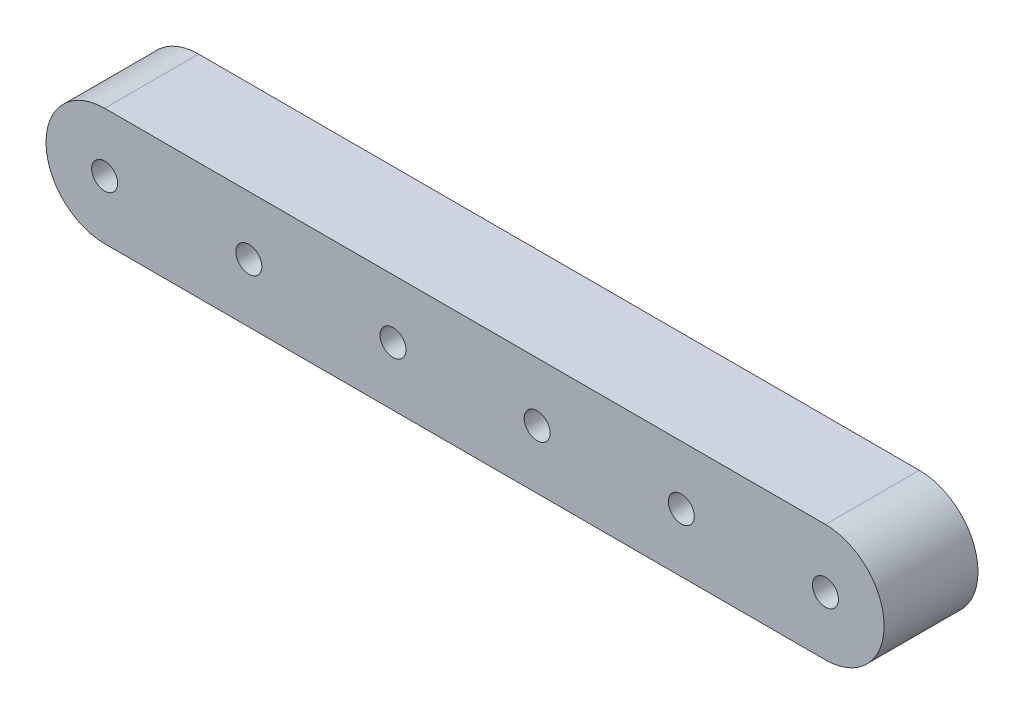
ISO-10303-21;
HEADER;
FILE_DESCRIPTION(('STEP AP214'),'2;1');
FILE_NAME('part.step','',(''),(''),'','','');
FILE_SCHEMA(('AUTOMOTIVE_DESIGN { 1 0 10303 214 1 1 1 1 }'));
ENDSEC;
DATA;
#1=APPLICATION_CONTEXT('core data for automotive mechanical design processes');
#2=APPLICATION_PROTOCOL_DEFINITION('international standard','automotive_design',2000,#1);
#3=PRODUCT_CONTEXT('',#1,'mechanical');
#4=PRODUCT('Part','Part','',(#3));
#5=PRODUCT_RELATED_PRODUCT_CATEGORY('part','',(#4));
#6=PRODUCT_DEFINITION_FORMATION('','',#4);
#7=PRODUCT_DEFINITION_CONTEXT('part definition',#1,'design');
#8=PRODUCT_DEFINITION('design','',#6,#7);
#9=PRODUCT_DEFINITION_SHAPE('','',#8);
#10=(LENGTH_UNIT() NAMED_UNIT(*) SI_UNIT(.MILLI.,.METRE.));
#11=(NAMED_UNIT(*) PLANE_ANGLE_UNIT() SI_UNIT($,.RADIAN.));
#12=(NAMED_UNIT(*) SI_UNIT($,.STERADIAN.) SOLID_ANGLE_UNIT());
#13=UNCERTAINTY_MEASURE_WITH_UNIT(LENGTH_MEASURE(1.E-05),#10,'distance_accuracy_value','');
#14=(GEOMETRIC_REPRESENTATION_CONTEXT(3) GLOBAL_UNCERTAINTY_ASSIGNED_CONTEXT((#13)) GLOBAL_UNIT_ASSIGNED_CONTEXT((#10,
#11,#12)) REPRESENTATION_CONTEXT('',''));
#15=CARTESIAN_POINT('',(0.,0.,0.));
#16=DIRECTION('',(0.,0.,1.));
#17=DIRECTION('',(1.,0.,0.));
#18=AXIS2_PLACEMENT_3D('',#15,#16,#17);
#19=CARTESIAN_POINT('',(-54.8096085409253,0.,-5.6));
#20=DIRECTION('',(0.,0.,1.));
#21=DIRECTION('',(1.,0.,0.));
#22=AXIS2_PLACEMENT_3D('',#19,#20,#21);
#23=CYLINDRICAL_SURFACE('',#22,7.);
#24=DIRECTION('',(0.,0.,1.));
#25=VECTOR('',#24,1.);
#26=CARTESIAN_POINT('',(-54.8096085409253,-7.,-5.6));
#27=LINE('',#26,#25);
#28=CARTESIAN_POINT('',(-54.8096085409253,-7.,-5.6));
#29=VERTEX_POINT('',#28);
#30=CARTESIAN_POINT('',(-54.8096085409253,-7.,5.6));
#31=VERTEX_POINT('',#30);
#32=EDGE_CURVE('E40',#29,#31,#27,.T.);
#33=ORIENTED_EDGE('',*,*,#32,.T.);
#34=CARTESIAN_POINT('',(-54.8096085409253,0.,5.6));
#35=DIRECTION('',(0.,0.,1.));
#36=DIRECTION('',(1.,0.,0.));
#37=AXIS2_PLACEMENT_3D('',#34,#35,#36);
#38=CIRCLE('',#37,7.);
#39=CARTESIAN_POINT('',(-54.8096085409253,7.,5.6));
#40=VERTEX_POINT('',#39);
#41=EDGE_CURVE('E77',#40,#31,#38,.T.);
#42=ORIENTED_EDGE('',*,*,#41,.F.);
#43=DIRECTION('',(0.,0.,1.));
#44=VECTOR('',#43,1.);
#45=CARTESIAN_POINT('',(-54.8096085409253,7.,-5.6));
#46=LINE('',#45,#44);
#47=CARTESIAN_POINT('',(-54.8096085409253,7.,-5.6));
#48=VERTEX_POINT('',#47);
#49=EDGE_CURVE('E11',#48,#40,#46,.T.);
#50=ORIENTED_EDGE('',*,*,#49,.F.);
#51=CARTESIAN_POINT('',(-54.8096085409253,0.,-5.6));
#52=DIRECTION('',(0.,0.,1.));
#53=DIRECTION('',(1.,0.,0.));
#54=AXIS2_PLACEMENT_3D('',#51,#52,#53);
#55=CIRCLE('',#54,7.);
#56=EDGE_CURVE('E78',#48,#29,#55,.T.);
#57=ORIENTED_EDGE('',*,*,#56,.T.);
#58=EDGE_LOOP('',(#33,#42,#50,#57));
#59=FACE_BOUND('',#58,.T.);
#60=ADVANCED_FACE('F37',(#59),#23,.T.);
#61=CARTESIAN_POINT('',(-54.8096085409253,7.,-5.6));
#62=DIRECTION('',(0.,1.,0.));
#63=DIRECTION('',(0.,0.,1.));
#64=AXIS2_PLACEMENT_3D('',#61,#62,#63);
#65=PLANE('',#64);
#66=ORIENTED_EDGE('',*,*,#49,.T.);
#67=DIRECTION('',(-1.,0.,0.));
#68=VECTOR('',#67,1.);
#69=CARTESIAN_POINT('',(-54.8096085409253,7.,5.6));
#70=LINE('',#69,#68);
#71=CARTESIAN_POINT('',(31.1903914590747,7.,5.6));
#72=VERTEX_POINT('',#71);
#73=EDGE_CURVE('E94',#72,#40,#70,.T.);
#74=ORIENTED_EDGE('',*,*,#73,.F.);
#75=DIRECTION('',(0.,0.,1.));
#76=VECTOR('',#75,1.);
#77=CARTESIAN_POINT('',(31.1903914590747,7.,-5.6));
#78=LINE('',#77,#76);
#79=CARTESIAN_POINT('',(31.1903914590747,7.,-5.6));
#80=VERTEX_POINT('',#79);
#81=EDGE_CURVE('E45',#80,#72,#78,.T.);
#82=ORIENTED_EDGE('',*,*,#81,.F.);
#83=DIRECTION('',(-1.,0.,0.));
#84=VECTOR('',#83,1.);
#85=CARTESIAN_POINT('',(-54.8096085409253,7.,-5.6));
#86=LINE('',#85,#84);
#87=EDGE_CURVE('E83',#80,#48,#86,.T.);
#88=ORIENTED_EDGE('',*,*,#87,.T.);
#89=EDGE_LOOP('',(#66,#74,#82,#88));
#90=FACE_BOUND('',#89,.T.);
#91=ADVANCED_FACE('F116',(#90),#65,.T.);
#92=CARTESIAN_POINT('',(31.1903914590747,0.,-5.6));
#93=DIRECTION('',(0.,0.,1.));
#94=DIRECTION('',(1.,0.,0.));
#95=AXIS2_PLACEMENT_3D('',#92,#93,#94);
#96=CYLINDRICAL_SURFACE('',#95,7.);
#97=ORIENTED_EDGE('',*,*,#81,.T.);
#98=CARTESIAN_POINT('',(31.1903914590747,0.,5.6));
#99=DIRECTION('',(0.,0.,1.));
#100=DIRECTION('',(1.,0.,0.));
#101=AXIS2_PLACEMENT_3D('',#98,#99,#100);
#102=CIRCLE('',#101,7.);
#103=CARTESIAN_POINT('',(31.1903914590747,-7.,5.6));
#104=VERTEX_POINT('',#103);
#105=EDGE_CURVE('E90',#104,#72,#102,.T.);
#106=ORIENTED_EDGE('',*,*,#105,.F.);
#107=DIRECTION('',(0.,0.,1.));
#108=VECTOR('',#107,1.);
#109=CARTESIAN_POINT('',(31.1903914590747,-7.,-5.6));
#110=LINE('',#109,#108);
#111=CARTESIAN_POINT('',(31.1903914590747,-7.,-5.6));
#112=VERTEX_POINT('',#111);
#113=EDGE_CURVE('E82',#112,#104,#110,.T.);
#114=ORIENTED_EDGE('',*,*,#113,.F.);
#115=CARTESIAN_POINT('',(31.1903914590747,0.,-5.6));
#116=DIRECTION('',(0.,0.,1.));
#117=DIRECTION('',(1.,0.,0.));
#118=AXIS2_PLACEMENT_3D('',#115,#116,#117);
#119=CIRCLE('',#118,7.);
#120=EDGE_CURVE('E109',#112,#80,#119,.T.);
#121=ORIENTED_EDGE('',*,*,#120,.T.);
#122=EDGE_LOOP('',(#97,#106,#114,#121));
#123=FACE_BOUND('',#122,.T.);
#124=ADVANCED_FACE('F113',(#123),#96,.T.);
#125=CARTESIAN_POINT('',(-54.8096085409253,-7.,-5.6));
#126=DIRECTION('',(0.,-1.,0.));
#127=DIRECTION('',(0.,0.,-1.));
#128=AXIS2_PLACEMENT_3D('',#125,#126,#127);
#129=PLANE('',#128);
#130=ORIENTED_EDGE('',*,*,#113,.T.);
#131=DIRECTION('',(1.,0.,0.));
#132=VECTOR('',#131,1.);
#133=CARTESIAN_POINT('',(-54.8096085409253,-7.,5.6));
#134=LINE('',#133,#132);
#135=EDGE_CURVE('E85',#31,#104,#134,.T.);
#136=ORIENTED_EDGE('',*,*,#135,.F.);
#137=ORIENTED_EDGE('',*,*,#32,.F.);
#138=DIRECTION('',(1.,0.,0.));
#139=VECTOR('',#138,1.);
#140=CARTESIAN_POINT('',(-54.8096085409253,-7.,-5.6));
#141=LINE('',#140,#139);
#142=EDGE_CURVE('E107',#29,#112,#141,.T.);
#143=ORIENTED_EDGE('',*,*,#142,.T.);
#144=EDGE_LOOP('',(#130,#136,#137,#143));
#145=FACE_BOUND('',#144,.T.);
#146=ADVANCED_FACE('F86',(#145),#129,.T.);
#147=CARTESIAN_POINT('',(-54.8096085409253,0.,-5.6));
#148=DIRECTION('',(0.,0.,1.));
#149=DIRECTION('',(1.,0.,0.));
#150=AXIS2_PLACEMENT_3D('',#147,#148,#149);
#151=PLANE('',#150);
#152=CARTESIAN_POINT('',(-54.8096085409253,0.,-5.6));
#153=DIRECTION('',(0.,0.,1.));
#154=DIRECTION('',(1.,0.,0.));
#155=AXIS2_PLACEMENT_3D('',#152,#153,#154);
#156=CIRCLE('',#155,1.55);
#157=CARTESIAN_POINT('',(-53.2596085409253,0.,-5.6));
#158=VERTEX_POINT('',#157);
#159=EDGE_CURVE('E98',#158,#158,#156,.T.);
#160=ORIENTED_EDGE('',*,*,#159,.T.);
#161=EDGE_LOOP('',(#160));
#162=FACE_BOUND('',#161,.T.);
#163=CARTESIAN_POINT('',(-37.6096085409253,0.,-5.6));
#164=DIRECTION('',(0.,0.,1.));
#165=DIRECTION('',(1.,0.,0.));
#166=AXIS2_PLACEMENT_3D('',#163,#164,#165);
#167=CIRCLE('',#166,1.55);
#168=CARTESIAN_POINT('',(-36.0596085409253,0.,-5.6));
#169=VERTEX_POINT('',#168);
#170=EDGE_CURVE('E257',#169,#169,#167,.T.);
#171=ORIENTED_EDGE('',*,*,#170,.T.);
#172=EDGE_LOOP('',(#171));
#173=FACE_BOUND('',#172,.T.);
#174=CARTESIAN_POINT('',(-20.4096085409253,0.,-5.6));
#175=DIRECTION('',(0.,0.,1.));
#176=DIRECTION('',(1.,0.,0.));
#177=AXIS2_PLACEMENT_3D('',#174,#175,#176);
#178=CIRCLE('',#177,1.55);
#179=CARTESIAN_POINT('',(-18.8596085409253,0.,-5.6));
#180=VERTEX_POINT('',#179);
#181=EDGE_CURVE('E253',#180,#180,#178,.T.);
#182=ORIENTED_EDGE('',*,*,#181,.T.);
#183=EDGE_LOOP('',(#182));
#184=FACE_BOUND('',#183,.T.);
#185=CARTESIAN_POINT('',(-3.20960854092527,0.,-5.6));
#186=DIRECTION('',(0.,0.,1.));
#187=DIRECTION('',(1.,0.,0.));
#188=AXIS2_PLACEMENT_3D('',#185,#186,#187);
#189=CIRCLE('',#188,1.55);
#190=CARTESIAN_POINT('',(-1.65960854092527,0.,-5.6));
#191=VERTEX_POINT('',#190);
#192=EDGE_CURVE('E250',#191,#191,#189,.T.);
#193=ORIENTED_EDGE('',*,*,#192,.T.);
#194=EDGE_LOOP('',(#193));
#195=FACE_BOUND('',#194,.T.);
#196=CARTESIAN_POINT('',(13.9903914590747,0.,-5.6));
#197=DIRECTION('',(0.,0.,1.));
#198=DIRECTION('',(1.,0.,0.));
#199=AXIS2_PLACEMENT_3D('',#196,#197,#198);
#200=CIRCLE('',#199,1.55);
#201=CARTESIAN_POINT('',(15.5403914590747,0.,-5.6));
#202=VERTEX_POINT('',#201);
#203=EDGE_CURVE('E242',#202,#202,#200,.T.);
#204=ORIENTED_EDGE('',*,*,#203,.T.);
#205=EDGE_LOOP('',(#204));
#206=FACE_BOUND('',#205,.T.);
#207=CARTESIAN_POINT('',(31.1903914590747,0.,-5.6));
#208=DIRECTION('',(0.,0.,1.));
#209=DIRECTION('',(1.,0.,0.));
#210=AXIS2_PLACEMENT_3D('',#207,#208,#209);
#211=CIRCLE('',#210,1.55);
#212=CARTESIAN_POINT('',(32.7403914590747,0.,-5.6));
#213=VERTEX_POINT('',#212);
#214=EDGE_CURVE('E243',#213,#213,#211,.T.);
#215=ORIENTED_EDGE('',*,*,#214,.T.);
#216=EDGE_LOOP('',(#215));
#217=FACE_BOUND('',#216,.T.);
#218=ORIENTED_EDGE('',*,*,#56,.F.);
#219=ORIENTED_EDGE('',*,*,#87,.F.);
#220=ORIENTED_EDGE('',*,*,#120,.F.);
#221=ORIENTED_EDGE('',*,*,#142,.F.);
#222=EDGE_LOOP('',(#218,#219,#220,#221));
#223=FACE_BOUND('',#222,.T.);
#224=ADVANCED_FACE('F118',(#162,#173,#184,#195,#206,#217,#223),#151,.F.);
#225=CARTESIAN_POINT('',(-54.8096085409253,0.,5.6));
#226=DIRECTION('',(0.,0.,1.));
#227=DIRECTION('',(1.,0.,0.));
#228=AXIS2_PLACEMENT_3D('',#225,#226,#227);
#229=PLANE('',#228);
#230=CARTESIAN_POINT('',(-54.8096085409253,0.,5.6));
#231=DIRECTION('',(0.,0.,1.));
#232=DIRECTION('',(1.,0.,0.));
#233=AXIS2_PLACEMENT_3D('',#230,#231,#232);
#234=CIRCLE('',#233,1.55);
#235=CARTESIAN_POINT('',(-53.2596085409253,0.,5.6));
#236=VERTEX_POINT('',#235);
#237=EDGE_CURVE('E95',#236,#236,#234,.T.);
#238=ORIENTED_EDGE('',*,*,#237,.F.);
#239=EDGE_LOOP('',(#238));
#240=FACE_BOUND('',#239,.T.);
#241=CARTESIAN_POINT('',(-37.6096085409253,0.,5.6));
#242=DIRECTION('',(0.,0.,1.));
#243=DIRECTION('',(1.,0.,0.));
#244=AXIS2_PLACEMENT_3D('',#241,#242,#243);
#245=CIRCLE('',#244,1.55);
#246=CARTESIAN_POINT('',(-36.0596085409253,0.,5.6));
#247=VERTEX_POINT('',#246);
#248=EDGE_CURVE('E226',#247,#247,#245,.T.);
#249=ORIENTED_EDGE('',*,*,#248,.F.);
#250=EDGE_LOOP('',(#249));
#251=FACE_BOUND('',#250,.T.);
#252=CARTESIAN_POINT('',(-20.4096085409253,0.,5.6));
#253=DIRECTION('',(0.,0.,1.));
#254=DIRECTION('',(1.,0.,0.));
#255=AXIS2_PLACEMENT_3D('',#252,#253,#254);
#256=CIRCLE('',#255,1.55);
#257=CARTESIAN_POINT('',(-18.8596085409253,0.,5.6));
#258=VERTEX_POINT('',#257);
#259=EDGE_CURVE('E230',#258,#258,#256,.T.);
#260=ORIENTED_EDGE('',*,*,#259,.F.);
#261=EDGE_LOOP('',(#260));
#262=FACE_BOUND('',#261,.T.);
#263=CARTESIAN_POINT('',(-3.20960854092527,0.,5.6));
#264=DIRECTION('',(0.,0.,1.));
#265=DIRECTION('',(1.,0.,0.));
#266=AXIS2_PLACEMENT_3D('',#263,#264,#265);
#267=CIRCLE('',#266,1.55);
#268=CARTESIAN_POINT('',(-1.65960854092527,0.,5.6));
#269=VERTEX_POINT('',#268);
#270=EDGE_CURVE('E234',#269,#269,#267,.T.);
#271=ORIENTED_EDGE('',*,*,#270,.F.);
#272=EDGE_LOOP('',(#271));
#273=FACE_BOUND('',#272,.T.);
#274=CARTESIAN_POINT('',(13.9903914590747,0.,5.6));
#275=DIRECTION('',(0.,0.,1.));
#276=DIRECTION('',(1.,0.,0.));
#277=AXIS2_PLACEMENT_3D('',#274,#275,#276);
#278=CIRCLE('',#277,1.55);
#279=CARTESIAN_POINT('',(15.5403914590747,0.,5.6));
#280=VERTEX_POINT('',#279);
#281=EDGE_CURVE('E238',#280,#280,#278,.T.);
#282=ORIENTED_EDGE('',*,*,#281,.F.);
#283=EDGE_LOOP('',(#282));
#284=FACE_BOUND('',#283,.T.);
#285=CARTESIAN_POINT('',(31.1903914590747,0.,5.6));
#286=DIRECTION('',(0.,0.,1.));
#287=DIRECTION('',(1.,0.,0.));
#288=AXIS2_PLACEMENT_3D('',#285,#286,#287);
#289=CIRCLE('',#288,1.55);
#290=CARTESIAN_POINT('',(32.7403914590747,0.,5.6));
#291=VERTEX_POINT('',#290);
#292=EDGE_CURVE('E101',#291,#291,#289,.T.);
#293=ORIENTED_EDGE('',*,*,#292,.F.);
#294=EDGE_LOOP('',(#293));
#295=FACE_BOUND('',#294,.T.);
#296=ORIENTED_EDGE('',*,*,#41,.T.);
#297=ORIENTED_EDGE('',*,*,#135,.T.);
#298=ORIENTED_EDGE('',*,*,#105,.T.);
#299=ORIENTED_EDGE('',*,*,#73,.T.);
#300=EDGE_LOOP('',(#296,#297,#298,#299));
#301=FACE_BOUND('',#300,.T.);
#302=ADVANCED_FACE('F93',(#240,#251,#262,#273,#284,#295,#301),#229,.T.);
#303=CARTESIAN_POINT('',(31.1903914590747,0.,9.9840620433566));
#304=DIRECTION('',(0.,0.,-1.));
#305=DIRECTION('',(-1.,0.,0.));
#306=AXIS2_PLACEMENT_3D('',#303,#304,#305);
#307=CYLINDRICAL_SURFACE('',#306,1.55);
#308=ORIENTED_EDGE('',*,*,#214,.F.);
#309=EDGE_LOOP('',(#308));
#310=FACE_BOUND('',#309,.T.);
#311=ORIENTED_EDGE('',*,*,#292,.T.);
#312=EDGE_LOOP('',(#311));
#313=FACE_BOUND('',#312,.T.);
#314=ADVANCED_FACE('F126',(#310,#313),#307,.F.);
#315=CARTESIAN_POINT('',(13.9903914590747,0.,9.9840620433566));
#316=DIRECTION('',(0.,0.,-1.));
#317=DIRECTION('',(-1.,0.,0.));
#318=AXIS2_PLACEMENT_3D('',#315,#316,#317);
#319=CYLINDRICAL_SURFACE('',#318,1.55);
#320=ORIENTED_EDGE('',*,*,#203,.F.);
#321=EDGE_LOOP('',(#320));
#322=FACE_BOUND('',#321,.T.);
#323=ORIENTED_EDGE('',*,*,#281,.T.);
#324=EDGE_LOOP('',(#323));
#325=FACE_BOUND('',#324,.T.);
#326=ADVANCED_FACE('F165',(#322,#325),#319,.F.);
#327=CARTESIAN_POINT('',(-3.20960854092527,0.,9.9840620433566));
#328=DIRECTION('',(0.,0.,-1.));
#329=DIRECTION('',(-1.,0.,0.));
#330=AXIS2_PLACEMENT_3D('',#327,#328,#329);
#331=CYLINDRICAL_SURFACE('',#330,1.55);
#332=ORIENTED_EDGE('',*,*,#192,.F.);
#333=EDGE_LOOP('',(#332));
#334=FACE_BOUND('',#333,.T.);
#335=ORIENTED_EDGE('',*,*,#270,.T.);
#336=EDGE_LOOP('',(#335));
#337=FACE_BOUND('',#336,.T.);
#338=ADVANCED_FACE('F175',(#334,#337),#331,.F.);
#339=CARTESIAN_POINT('',(-20.4096085409253,0.,9.9840620433566));
#340=DIRECTION('',(0.,0.,-1.));
#341=DIRECTION('',(-1.,0.,0.));
#342=AXIS2_PLACEMENT_3D('',#339,#340,#341);
#343=CYLINDRICAL_SURFACE('',#342,1.55);
#344=ORIENTED_EDGE('',*,*,#181,.F.);
#345=EDGE_LOOP('',(#344));
#346=FACE_BOUND('',#345,.T.);
#347=ORIENTED_EDGE('',*,*,#259,.T.);
#348=EDGE_LOOP('',(#347));
#349=FACE_BOUND('',#348,.T.);
#350=ADVANCED_FACE('F185',(#346,#349),#343,.F.);
#351=CARTESIAN_POINT('',(-37.6096085409253,0.,9.9840620433566));
#352=DIRECTION('',(0.,0.,-1.));
#353=DIRECTION('',(-1.,0.,0.));
#354=AXIS2_PLACEMENT_3D('',#351,#352,#353);
#355=CYLINDRICAL_SURFACE('',#354,1.55);
#356=ORIENTED_EDGE('',*,*,#170,.F.);
#357=EDGE_LOOP('',(#356));
#358=FACE_BOUND('',#357,.T.);
#359=ORIENTED_EDGE('',*,*,#248,.T.);
#360=EDGE_LOOP('',(#359));
#361=FACE_BOUND('',#360,.T.);
#362=ADVANCED_FACE('F195',(#358,#361),#355,.F.);
#363=CARTESIAN_POINT('',(-54.8096085409253,0.,9.9840620433566));
#364=DIRECTION('',(0.,0.,-1.));
#365=DIRECTION('',(-1.,0.,0.));
#366=AXIS2_PLACEMENT_3D('',#363,#364,#365);
#367=CYLINDRICAL_SURFACE('',#366,1.55);
#368=ORIENTED_EDGE('',*,*,#159,.F.);
#369=EDGE_LOOP('',(#368));
#370=FACE_BOUND('',#369,.T.);
#371=ORIENTED_EDGE('',*,*,#237,.T.);
#372=EDGE_LOOP('',(#371));
#373=FACE_BOUND('',#372,.T.);
#374=ADVANCED_FACE('F205',(#370,#373),#367,.F.);
#375=CLOSED_SHELL('',(#60,#91,#124,#146,#224,#302,#314,#326,#338,#350,#362,#374));
#376=MANIFOLD_SOLID_BREP('B2',#375);
#377=ADVANCED_BREP_SHAPE_REPRESENTATION('',(#18,#376),#14);
#378=SHAPE_DEFINITION_REPRESENTATION(#9,#377);
ENDSEC;
END-ISO-10303-21;
